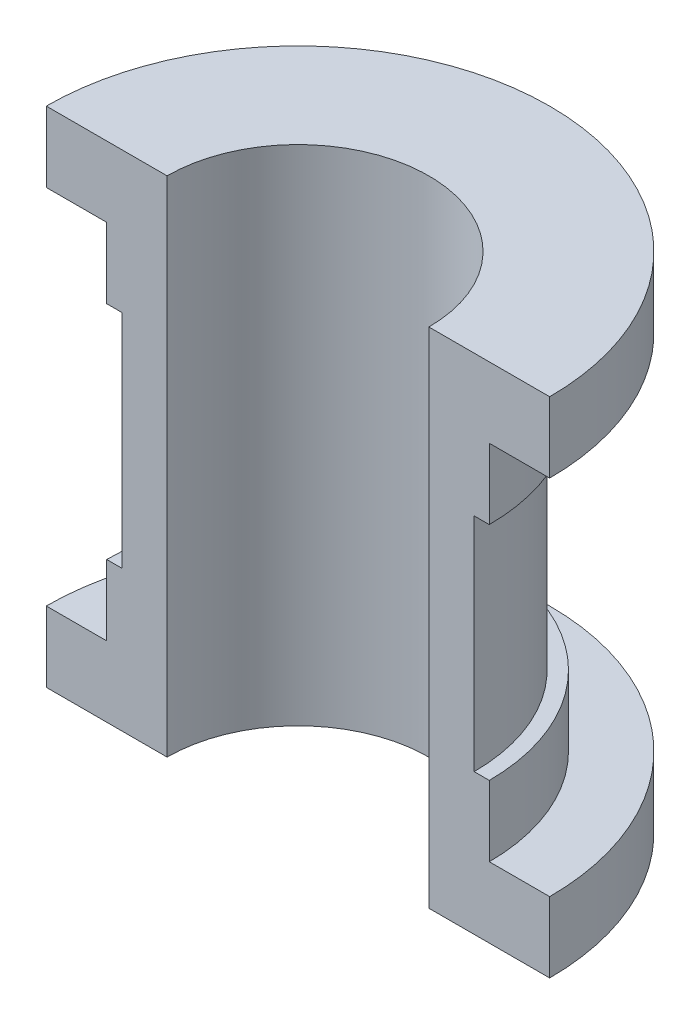
ISO-10303-21;
HEADER;
FILE_DESCRIPTION(('STEP AP214'),'2;1');
FILE_NAME('part.step','',(''),(''),'','','');
FILE_SCHEMA(('AUTOMOTIVE_DESIGN { 1 0 10303 214 1 1 1 1 }'));
ENDSEC;
DATA;
#1=APPLICATION_CONTEXT('core data for automotive mechanical design processes');
#2=APPLICATION_PROTOCOL_DEFINITION('international standard','automotive_design',2000,#1);
#3=PRODUCT_CONTEXT('',#1,'mechanical');
#4=PRODUCT('Part','Part','',(#3));
#5=PRODUCT_RELATED_PRODUCT_CATEGORY('part','',(#4));
#6=PRODUCT_DEFINITION_FORMATION('','',#4);
#7=PRODUCT_DEFINITION_CONTEXT('part definition',#1,'design');
#8=PRODUCT_DEFINITION('design','',#6,#7);
#9=PRODUCT_DEFINITION_SHAPE('','',#8);
#10=(LENGTH_UNIT() NAMED_UNIT(*) SI_UNIT(.MILLI.,.METRE.));
#11=(NAMED_UNIT(*) PLANE_ANGLE_UNIT() SI_UNIT($,.RADIAN.));
#12=(NAMED_UNIT(*) SI_UNIT($,.STERADIAN.) SOLID_ANGLE_UNIT());
#13=UNCERTAINTY_MEASURE_WITH_UNIT(LENGTH_MEASURE(1.E-05),#10,'distance_accuracy_value','');
#14=(GEOMETRIC_REPRESENTATION_CONTEXT(3) GLOBAL_UNCERTAINTY_ASSIGNED_CONTEXT((#13)) GLOBAL_UNIT_ASSIGNED_CONTEXT((#10,
#11,#12)) REPRESENTATION_CONTEXT('',''));
#15=CARTESIAN_POINT('',(0.,0.,0.));
#16=DIRECTION('',(0.,0.,1.));
#17=DIRECTION('',(1.,0.,0.));
#18=AXIS2_PLACEMENT_3D('',#15,#16,#17);
#19=CARTESIAN_POINT('',(0.,-25.,-22.5));
#20=DIRECTION('',(0.,0.,1.));
#21=DIRECTION('',(1.,0.,0.));
#22=AXIS2_PLACEMENT_3D('',#19,#20,#21);
#23=CYLINDRICAL_SURFACE('',#22,3.);
#24=CARTESIAN_POINT('',(0.,-25.,-22.5));
#25=DIRECTION('',(0.,0.,1.));
#26=DIRECTION('',(1.,0.,0.));
#27=AXIS2_PLACEMENT_3D('',#24,#25,#26);
#28=CIRCLE('',#27,3.);
#29=CARTESIAN_POINT('',(3.,-25.,-22.5));
#30=VERTEX_POINT('',#29);
#31=EDGE_CURVE('E11',#30,#30,#28,.T.);
#32=ORIENTED_EDGE('',*,*,#31,.T.);
#33=EDGE_LOOP('',(#32));
#34=FACE_BOUND('',#33,.T.);
#35=CARTESIAN_POINT('',(0.,-25.,-17.5));
#36=DIRECTION('',(0.,0.,1.));
#37=DIRECTION('',(1.,0.,0.));
#38=AXIS2_PLACEMENT_3D('',#35,#36,#37);
#39=CIRCLE('',#38,3.);
#40=CARTESIAN_POINT('',(3.,-25.,-17.5));
#41=VERTEX_POINT('',#40);
#42=EDGE_CURVE('E53',#41,#41,#39,.T.);
#43=ORIENTED_EDGE('',*,*,#42,.F.);
#44=EDGE_LOOP('',(#43));
#45=FACE_BOUND('',#44,.T.);
#46=ADVANCED_FACE('F50',(#34,#45),#23,.T.);
#47=CARTESIAN_POINT('',(0.,-25.,-22.5));
#48=DIRECTION('',(0.,0.,1.));
#49=DIRECTION('',(1.,0.,0.));
#50=AXIS2_PLACEMENT_3D('',#47,#48,#49);
#51=PLANE('',#50);
#52=ORIENTED_EDGE('',*,*,#31,.F.);
#53=EDGE_LOOP('',(#52));
#54=FACE_BOUND('',#53,.T.);
#55=ADVANCED_FACE('F69',(#54),#51,.F.);
#56=CARTESIAN_POINT('',(0.,-25.,-17.5));
#57=DIRECTION('',(0.,0.,1.));
#58=DIRECTION('',(1.,0.,0.));
#59=AXIS2_PLACEMENT_3D('',#56,#57,#58);
#60=PLANE('',#59);
#61=ORIENTED_EDGE('',*,*,#42,.T.);
#62=EDGE_LOOP('',(#61));
#63=FACE_BOUND('',#62,.T.);
#64=ADVANCED_FACE('F66',(#63),#60,.T.);
#65=CLOSED_SHELL('',(#46,#55,#64));
#66=MANIFOLD_SOLID_BREP('B2',#65);
#67=CARTESIAN_POINT('',(0.,-43.,0.));
#68=DIRECTION('',(0.,-1.,0.));
#69=DIRECTION('',(0.,0.,-1.));
#70=AXIS2_PLACEMENT_3D('',#67,#68,#69);
#71=PLANE('',#70);
#72=CARTESIAN_POINT('',(0.,-43.,0.));
#73=DIRECTION('',(0.,1.,0.));
#74=DIRECTION('',(0.,0.,1.));
#75=AXIS2_PLACEMENT_3D('',#72,#73,#74);
#76=CIRCLE('',#75,19.);
#77=CARTESIAN_POINT('',(19.,-43.,0.));
#78=VERTEX_POINT('',#77);
#79=CARTESIAN_POINT('',(-19.,-43.,0.));
#80=VERTEX_POINT('',#79);
#81=EDGE_CURVE('E209',#78,#80,#76,.T.);
#82=ORIENTED_EDGE('',*,*,#81,.F.);
#83=DIRECTION('',(-1.,0.,0.));
#84=VECTOR('',#83,1.);
#85=CARTESIAN_POINT('',(0.,-43.,0.));
#86=LINE('',#85,#84);
#87=CARTESIAN_POINT('',(25.,-43.,0.));
#88=VERTEX_POINT('',#87);
#89=EDGE_CURVE('E214',#88,#78,#86,.T.);
#90=ORIENTED_EDGE('',*,*,#89,.F.);
#91=CARTESIAN_POINT('',(0.,-43.,0.));
#92=DIRECTION('',(0.,-1.,0.));
#93=DIRECTION('',(0.,0.,-1.));
#94=AXIS2_PLACEMENT_3D('',#91,#92,#93);
#95=CIRCLE('',#94,25.);
#96=CARTESIAN_POINT('',(-25.,-43.,0.));
#97=VERTEX_POINT('',#96);
#98=EDGE_CURVE('E230',#97,#88,#95,.T.);
#99=ORIENTED_EDGE('',*,*,#98,.F.);
#100=EDGE_CURVE('E227',#80,#97,#86,.T.);
#101=ORIENTED_EDGE('',*,*,#100,.F.);
#102=EDGE_LOOP('',(#82,#90,#99,#101));
#103=FACE_BOUND('',#102,.T.);
#104=ADVANCED_FACE('F100',(#103),#71,.F.);
#105=CARTESIAN_POINT('',(0.,-7.,0.));
#106=DIRECTION('',(0.,0.,1.));
#107=DIRECTION('',(1.,0.,0.));
#108=AXIS2_PLACEMENT_3D('',#105,#106,#107);
#109=PLANE('',#108);
#110=DIRECTION('',(1.,0.,0.));
#111=VECTOR('',#110,1.);
#112=CARTESIAN_POINT('',(0.,-36.,0.));
#113=LINE('',#112,#111);
#114=CARTESIAN_POINT('',(17.5,-36.,0.));
#115=VERTEX_POINT('',#114);
#116=CARTESIAN_POINT('',(19.,-36.,0.));
#117=VERTEX_POINT('',#116);
#118=EDGE_CURVE('E200',#115,#117,#113,.T.);
#119=ORIENTED_EDGE('',*,*,#118,.F.);
#120=DIRECTION('',(0.,1.,0.));
#121=VECTOR('',#120,1.);
#122=CARTESIAN_POINT('',(17.5,-25.,0.));
#123=LINE('',#122,#121);
#124=CARTESIAN_POINT('',(17.5,-14.,0.));
#125=VERTEX_POINT('',#124);
#126=EDGE_CURVE('E249',#115,#125,#123,.T.);
#127=ORIENTED_EDGE('',*,*,#126,.T.);
#128=DIRECTION('',(1.,0.,0.));
#129=VECTOR('',#128,1.);
#130=CARTESIAN_POINT('',(0.,-14.,0.));
#131=LINE('',#130,#129);
#132=CARTESIAN_POINT('',(19.,-14.,0.));
#133=VERTEX_POINT('',#132);
#134=EDGE_CURVE('E254',#125,#133,#131,.T.);
#135=ORIENTED_EDGE('',*,*,#134,.T.);
#136=DIRECTION('',(0.,1.,0.));
#137=VECTOR('',#136,1.);
#138=CARTESIAN_POINT('',(19.,-14.,0.));
#139=LINE('',#138,#137);
#140=CARTESIAN_POINT('',(19.,-7.,0.));
#141=VERTEX_POINT('',#140);
#142=EDGE_CURVE('E267',#133,#141,#139,.T.);
#143=ORIENTED_EDGE('',*,*,#142,.T.);
#144=DIRECTION('',(1.,0.,0.));
#145=VECTOR('',#144,1.);
#146=CARTESIAN_POINT('',(0.,-7.,0.));
#147=LINE('',#146,#145);
#148=CARTESIAN_POINT('',(25.,-7.,0.));
#149=VERTEX_POINT('',#148);
#150=EDGE_CURVE('E278',#141,#149,#147,.T.);
#151=ORIENTED_EDGE('',*,*,#150,.T.);
#152=DIRECTION('',(0.,1.,0.));
#153=VECTOR('',#152,1.);
#154=CARTESIAN_POINT('',(25.,-7.,0.));
#155=LINE('',#154,#153);
#156=CARTESIAN_POINT('',(25.,0.,0.));
#157=VERTEX_POINT('',#156);
#158=EDGE_CURVE('E104',#149,#157,#155,.T.);
#159=ORIENTED_EDGE('',*,*,#158,.T.);
#160=DIRECTION('',(1.,0.,0.));
#161=VECTOR('',#160,1.);
#162=CARTESIAN_POINT('',(0.,0.,0.));
#163=LINE('',#162,#161);
#164=CARTESIAN_POINT('',(13.,0.,0.));
#165=VERTEX_POINT('',#164);
#166=EDGE_CURVE('E274',#165,#157,#163,.T.);
#167=ORIENTED_EDGE('',*,*,#166,.F.);
#168=DIRECTION('',(0.,1.,0.));
#169=VECTOR('',#168,1.);
#170=CARTESIAN_POINT('',(13.,-7.,0.));
#171=LINE('',#170,#169);
#172=CARTESIAN_POINT('',(13.,-50.,0.));
#173=VERTEX_POINT('',#172);
#174=EDGE_CURVE('E48',#173,#165,#171,.T.);
#175=ORIENTED_EDGE('',*,*,#174,.F.);
#176=DIRECTION('',(-1.,0.,0.));
#177=VECTOR('',#176,1.);
#178=CARTESIAN_POINT('',(0.,-50.,0.));
#179=LINE('',#178,#177);
#180=CARTESIAN_POINT('',(25.,-50.,0.));
#181=VERTEX_POINT('',#180);
#182=EDGE_CURVE('E231',#181,#173,#179,.T.);
#183=ORIENTED_EDGE('',*,*,#182,.F.);
#184=DIRECTION('',(0.,-1.,0.));
#185=VECTOR('',#184,1.);
#186=CARTESIAN_POINT('',(25.,-43.,0.));
#187=LINE('',#186,#185);
#188=EDGE_CURVE('E242',#88,#181,#187,.T.);
#189=ORIENTED_EDGE('',*,*,#188,.F.);
#190=ORIENTED_EDGE('',*,*,#89,.T.);
#191=DIRECTION('',(0.,-1.,0.));
#192=VECTOR('',#191,1.);
#193=CARTESIAN_POINT('',(19.,-36.,0.));
#194=LINE('',#193,#192);
#195=EDGE_CURVE('E195',#117,#78,#194,.T.);
#196=ORIENTED_EDGE('',*,*,#195,.F.);
#197=EDGE_LOOP('',(#119,#127,#135,#143,#151,#159,#167,#175,#183,#189,#190,#196));
#198=FACE_BOUND('',#197,.T.);
#199=ADVANCED_FACE('F212',(#198),#109,.T.);
#200=CARTESIAN_POINT('',(0.,-7.,0.));
#201=DIRECTION('',(0.,1.,0.));
#202=DIRECTION('',(0.,0.,1.));
#203=AXIS2_PLACEMENT_3D('',#200,#201,#202);
#204=CYLINDRICAL_SURFACE('',#203,13.);
#205=CARTESIAN_POINT('',(0.,0.,0.));
#206=DIRECTION('',(0.,1.,0.));
#207=DIRECTION('',(0.,0.,1.));
#208=AXIS2_PLACEMENT_3D('',#205,#206,#207);
#209=CIRCLE('',#208,13.);
#210=CARTESIAN_POINT('',(-13.,0.,0.));
#211=VERTEX_POINT('',#210);
#212=EDGE_CURVE('E282',#165,#211,#209,.T.);
#213=ORIENTED_EDGE('',*,*,#212,.T.);
#214=DIRECTION('',(0.,1.,0.));
#215=VECTOR('',#214,1.);
#216=CARTESIAN_POINT('',(-13.,-7.,0.));
#217=LINE('',#216,#215);
#218=CARTESIAN_POINT('',(-13.,-50.,0.));
#219=VERTEX_POINT('',#218);
#220=EDGE_CURVE('E110',#219,#211,#217,.T.);
#221=ORIENTED_EDGE('',*,*,#220,.F.);
#222=CARTESIAN_POINT('',(0.,-50.,0.));
#223=DIRECTION('',(0.,-1.,0.));
#224=DIRECTION('',(0.,0.,-1.));
#225=AXIS2_PLACEMENT_3D('',#222,#223,#224);
#226=CIRCLE('',#225,13.);
#227=EDGE_CURVE('E216',#219,#173,#226,.T.);
#228=ORIENTED_EDGE('',*,*,#227,.T.);
#229=ORIENTED_EDGE('',*,*,#174,.T.);
#230=EDGE_LOOP('',(#213,#221,#228,#229));
#231=FACE_BOUND('',#230,.T.);
#232=ADVANCED_FACE('F353',(#231),#204,.F.);
#233=DIRECTION('',(0.,1.,0.));
#234=VECTOR('',#233,1.);
#235=CARTESIAN_POINT('',(-17.5,-25.,0.));
#236=LINE('',#235,#234);
#237=CARTESIAN_POINT('',(-17.5,-36.,0.));
#238=VERTEX_POINT('',#237);
#239=CARTESIAN_POINT('',(-17.5,-14.,0.));
#240=VERTEX_POINT('',#239);
#241=EDGE_CURVE('E245',#238,#240,#236,.T.);
#242=ORIENTED_EDGE('',*,*,#241,.F.);
#243=DIRECTION('',(1.,0.,0.));
#244=VECTOR('',#243,1.);
#245=CARTESIAN_POINT('',(0.,-36.,0.));
#246=LINE('',#245,#244);
#247=CARTESIAN_POINT('',(-19.,-36.,0.));
#248=VERTEX_POINT('',#247);
#249=EDGE_CURVE('E199',#248,#238,#246,.T.);
#250=ORIENTED_EDGE('',*,*,#249,.F.);
#251=DIRECTION('',(0.,-1.,0.));
#252=VECTOR('',#251,1.);
#253=CARTESIAN_POINT('',(-19.,-36.,0.));
#254=LINE('',#253,#252);
#255=EDGE_CURVE('E118',#248,#80,#254,.T.);
#256=ORIENTED_EDGE('',*,*,#255,.T.);
#257=ORIENTED_EDGE('',*,*,#100,.T.);
#258=DIRECTION('',(0.,-1.,0.));
#259=VECTOR('',#258,1.);
#260=CARTESIAN_POINT('',(-25.,-43.,0.));
#261=LINE('',#260,#259);
#262=CARTESIAN_POINT('',(-25.,-50.,0.));
#263=VERTEX_POINT('',#262);
#264=EDGE_CURVE('E246',#97,#263,#261,.T.);
#265=ORIENTED_EDGE('',*,*,#264,.T.);
#266=EDGE_CURVE('E222',#219,#263,#179,.T.);
#267=ORIENTED_EDGE('',*,*,#266,.F.);
#268=ORIENTED_EDGE('',*,*,#220,.T.);
#269=CARTESIAN_POINT('',(-25.,0.,0.));
#270=VERTEX_POINT('',#269);
#271=EDGE_CURVE('E291',#270,#211,#163,.T.);
#272=ORIENTED_EDGE('',*,*,#271,.F.);
#273=DIRECTION('',(0.,1.,0.));
#274=VECTOR('',#273,1.);
#275=CARTESIAN_POINT('',(-25.,-7.,0.));
#276=LINE('',#275,#274);
#277=CARTESIAN_POINT('',(-25.,-7.,0.));
#278=VERTEX_POINT('',#277);
#279=EDGE_CURVE('E299',#278,#270,#276,.T.);
#280=ORIENTED_EDGE('',*,*,#279,.F.);
#281=CARTESIAN_POINT('',(-19.,-7.,0.));
#282=VERTEX_POINT('',#281);
#283=EDGE_CURVE('E283',#278,#282,#147,.T.);
#284=ORIENTED_EDGE('',*,*,#283,.T.);
#285=DIRECTION('',(0.,1.,0.));
#286=VECTOR('',#285,1.);
#287=CARTESIAN_POINT('',(-19.,-14.,0.));
#288=LINE('',#287,#286);
#289=CARTESIAN_POINT('',(-19.,-14.,0.));
#290=VERTEX_POINT('',#289);
#291=EDGE_CURVE('E270',#290,#282,#288,.T.);
#292=ORIENTED_EDGE('',*,*,#291,.F.);
#293=EDGE_CURVE('E259',#290,#240,#131,.T.);
#294=ORIENTED_EDGE('',*,*,#293,.T.);
#295=EDGE_LOOP('',(#242,#250,#256,#257,#265,#267,#268,#272,#280,#284,#292,#294));
#296=FACE_BOUND('',#295,.T.);
#297=ADVANCED_FACE('F312',(#296),#109,.T.);
#298=CARTESIAN_POINT('',(0.,-7.,0.));
#299=DIRECTION('',(0.,1.,0.));
#300=DIRECTION('',(0.,0.,1.));
#301=AXIS2_PLACEMENT_3D('',#298,#299,#300);
#302=CYLINDRICAL_SURFACE('',#301,25.);
#303=CARTESIAN_POINT('',(0.,0.,0.));
#304=DIRECTION('',(0.,1.,0.));
#305=DIRECTION('',(0.,0.,1.));
#306=AXIS2_PLACEMENT_3D('',#303,#304,#305);
#307=CIRCLE('',#306,25.);
#308=EDGE_CURVE('E290',#157,#270,#307,.T.);
#309=ORIENTED_EDGE('',*,*,#308,.F.);
#310=ORIENTED_EDGE('',*,*,#158,.F.);
#311=CARTESIAN_POINT('',(0.,-7.,0.));
#312=DIRECTION('',(0.,1.,0.));
#313=DIRECTION('',(0.,0.,1.));
#314=AXIS2_PLACEMENT_3D('',#311,#312,#313);
#315=CIRCLE('',#314,25.);
#316=EDGE_CURVE('E281',#149,#278,#315,.T.);
#317=ORIENTED_EDGE('',*,*,#316,.T.);
#318=ORIENTED_EDGE('',*,*,#279,.T.);
#319=EDGE_LOOP('',(#309,#310,#317,#318));
#320=FACE_BOUND('',#319,.T.);
#321=ADVANCED_FACE('F102',(#320),#302,.T.);
#322=CARTESIAN_POINT('',(0.,-7.,0.));
#323=DIRECTION('',(0.,1.,0.));
#324=DIRECTION('',(0.,0.,1.));
#325=AXIS2_PLACEMENT_3D('',#322,#323,#324);
#326=PLANE('',#325);
#327=ORIENTED_EDGE('',*,*,#150,.F.);
#328=CARTESIAN_POINT('',(0.,-7.,0.));
#329=DIRECTION('',(0.,1.,0.));
#330=DIRECTION('',(0.,0.,1.));
#331=AXIS2_PLACEMENT_3D('',#328,#329,#330);
#332=CIRCLE('',#331,19.);
#333=EDGE_CURVE('E126',#141,#282,#332,.T.);
#334=ORIENTED_EDGE('',*,*,#333,.T.);
#335=ORIENTED_EDGE('',*,*,#283,.F.);
#336=ORIENTED_EDGE('',*,*,#316,.F.);
#337=EDGE_LOOP('',(#327,#334,#335,#336));
#338=FACE_BOUND('',#337,.T.);
#339=ADVANCED_FACE('F391',(#338),#326,.F.);
#340=CARTESIAN_POINT('',(0.,0.,0.));
#341=DIRECTION('',(0.,1.,0.));
#342=DIRECTION('',(0.,0.,1.));
#343=AXIS2_PLACEMENT_3D('',#340,#341,#342);
#344=PLANE('',#343);
#345=ORIENTED_EDGE('',*,*,#166,.T.);
#346=ORIENTED_EDGE('',*,*,#308,.T.);
#347=ORIENTED_EDGE('',*,*,#271,.T.);
#348=ORIENTED_EDGE('',*,*,#212,.F.);
#349=EDGE_LOOP('',(#345,#346,#347,#348));
#350=FACE_BOUND('',#349,.T.);
#351=ADVANCED_FACE('F390',(#350),#344,.T.);
#352=CARTESIAN_POINT('',(0.,-14.,0.));
#353=DIRECTION('',(0.,1.,0.));
#354=DIRECTION('',(0.,0.,1.));
#355=AXIS2_PLACEMENT_3D('',#352,#353,#354);
#356=CYLINDRICAL_SURFACE('',#355,19.);
#357=ORIENTED_EDGE('',*,*,#333,.F.);
#358=ORIENTED_EDGE('',*,*,#142,.F.);
#359=CARTESIAN_POINT('',(0.,-14.,0.));
#360=DIRECTION('',(0.,1.,0.));
#361=DIRECTION('',(0.,0.,1.));
#362=AXIS2_PLACEMENT_3D('',#359,#360,#361);
#363=CIRCLE('',#362,19.);
#364=EDGE_CURVE('E258',#133,#290,#363,.T.);
#365=ORIENTED_EDGE('',*,*,#364,.T.);
#366=ORIENTED_EDGE('',*,*,#291,.T.);
#367=EDGE_LOOP('',(#357,#358,#365,#366));
#368=FACE_BOUND('',#367,.T.);
#369=ADVANCED_FACE('F317',(#368),#356,.T.);
#370=CARTESIAN_POINT('',(0.,-14.,0.));
#371=DIRECTION('',(0.,1.,0.));
#372=DIRECTION('',(0.,0.,1.));
#373=AXIS2_PLACEMENT_3D('',#370,#371,#372);
#374=PLANE('',#373);
#375=ORIENTED_EDGE('',*,*,#134,.F.);
#376=CARTESIAN_POINT('',(0.,-14.,0.));
#377=DIRECTION('',(0.,1.,0.));
#378=DIRECTION('',(0.,0.,1.));
#379=AXIS2_PLACEMENT_3D('',#376,#377,#378);
#380=CIRCLE('',#379,17.5);
#381=EDGE_CURVE('E263',#125,#240,#380,.T.);
#382=ORIENTED_EDGE('',*,*,#381,.T.);
#383=ORIENTED_EDGE('',*,*,#293,.F.);
#384=ORIENTED_EDGE('',*,*,#364,.F.);
#385=EDGE_LOOP('',(#375,#382,#383,#384));
#386=FACE_BOUND('',#385,.T.);
#387=ADVANCED_FACE('F321',(#386),#374,.F.);
#388=CARTESIAN_POINT('',(0.,-25.,0.));
#389=DIRECTION('',(0.,1.,0.));
#390=DIRECTION('',(0.,0.,1.));
#391=AXIS2_PLACEMENT_3D('',#388,#389,#390);
#392=CYLINDRICAL_SURFACE('',#391,17.5);
#393=CARTESIAN_POINT('',(0.,-36.,0.));
#394=DIRECTION('',(0.,1.,0.));
#395=DIRECTION('',(0.,0.,1.));
#396=AXIS2_PLACEMENT_3D('',#393,#394,#395);
#397=CIRCLE('',#396,17.5);
#398=EDGE_CURVE('E205',#238,#115,#397,.F.);
#399=ORIENTED_EDGE('',*,*,#398,.F.);
#400=ORIENTED_EDGE('',*,*,#241,.T.);
#401=ORIENTED_EDGE('',*,*,#381,.F.);
#402=ORIENTED_EDGE('',*,*,#126,.F.);
#403=EDGE_LOOP('',(#399,#400,#401,#402));
#404=FACE_BOUND('',#403,.T.);
#405=ADVANCED_FACE('F324',(#404),#392,.T.);
#406=CARTESIAN_POINT('',(0.,-43.,0.));
#407=DIRECTION('',(0.,-1.,0.));
#408=DIRECTION('',(0.,0.,-1.));
#409=AXIS2_PLACEMENT_3D('',#406,#407,#408);
#410=CYLINDRICAL_SURFACE('',#409,25.);
#411=CARTESIAN_POINT('',(0.,-50.,0.));
#412=DIRECTION('',(0.,-1.,0.));
#413=DIRECTION('',(0.,0.,-1.));
#414=AXIS2_PLACEMENT_3D('',#411,#412,#413);
#415=CIRCLE('',#414,25.);
#416=EDGE_CURVE('E238',#263,#181,#415,.T.);
#417=ORIENTED_EDGE('',*,*,#416,.F.);
#418=ORIENTED_EDGE('',*,*,#264,.F.);
#419=ORIENTED_EDGE('',*,*,#98,.T.);
#420=ORIENTED_EDGE('',*,*,#188,.T.);
#421=EDGE_LOOP('',(#417,#418,#419,#420));
#422=FACE_BOUND('',#421,.T.);
#423=ADVANCED_FACE('F359',(#422),#410,.T.);
#424=CARTESIAN_POINT('',(0.,-50.,0.));
#425=DIRECTION('',(0.,-1.,0.));
#426=DIRECTION('',(0.,0.,-1.));
#427=AXIS2_PLACEMENT_3D('',#424,#425,#426);
#428=PLANE('',#427);
#429=ORIENTED_EDGE('',*,*,#227,.F.);
#430=ORIENTED_EDGE('',*,*,#266,.T.);
#431=ORIENTED_EDGE('',*,*,#416,.T.);
#432=ORIENTED_EDGE('',*,*,#182,.T.);
#433=EDGE_LOOP('',(#429,#430,#431,#432));
#434=FACE_BOUND('',#433,.T.);
#435=ADVANCED_FACE('F348',(#434),#428,.T.);
#436=CARTESIAN_POINT('',(0.,-36.,0.));
#437=DIRECTION('',(0.,-1.,0.));
#438=DIRECTION('',(0.,0.,-1.));
#439=AXIS2_PLACEMENT_3D('',#436,#437,#438);
#440=CYLINDRICAL_SURFACE('',#439,19.);
#441=ORIENTED_EDGE('',*,*,#81,.T.);
#442=ORIENTED_EDGE('',*,*,#255,.F.);
#443=CARTESIAN_POINT('',(0.,-36.,0.));
#444=DIRECTION('',(0.,1.,0.));
#445=DIRECTION('',(0.,0.,1.));
#446=AXIS2_PLACEMENT_3D('',#443,#444,#445);
#447=CIRCLE('',#446,19.);
#448=EDGE_CURVE('E191',#117,#248,#447,.T.);
#449=ORIENTED_EDGE('',*,*,#448,.F.);
#450=ORIENTED_EDGE('',*,*,#195,.T.);
#451=EDGE_LOOP('',(#441,#442,#449,#450));
#452=FACE_BOUND('',#451,.T.);
#453=ADVANCED_FACE('F193',(#452),#440,.T.);
#454=CARTESIAN_POINT('',(0.,-36.,0.));
#455=DIRECTION('',(0.,1.,0.));
#456=DIRECTION('',(0.,0.,1.));
#457=AXIS2_PLACEMENT_3D('',#454,#455,#456);
#458=PLANE('',#457);
#459=ORIENTED_EDGE('',*,*,#118,.T.);
#460=ORIENTED_EDGE('',*,*,#448,.T.);
#461=ORIENTED_EDGE('',*,*,#249,.T.);
#462=ORIENTED_EDGE('',*,*,#398,.T.);
#463=EDGE_LOOP('',(#459,#460,#461,#462));
#464=FACE_BOUND('',#463,.T.);
#465=ADVANCED_FACE('F203',(#464),#458,.T.);
#466=CLOSED_SHELL('',(#104,#199,#232,#297,#321,#339,#351,#369,#387,#405,#423,#435,#453,#465));
#467=MANIFOLD_SOLID_BREP('B6',#466);
#468=ADVANCED_BREP_SHAPE_REPRESENTATION('',(#18,#66,#467),#14);
#469=SHAPE_DEFINITION_REPRESENTATION(#9,#468);
ENDSEC;
END-ISO-10303-21;
